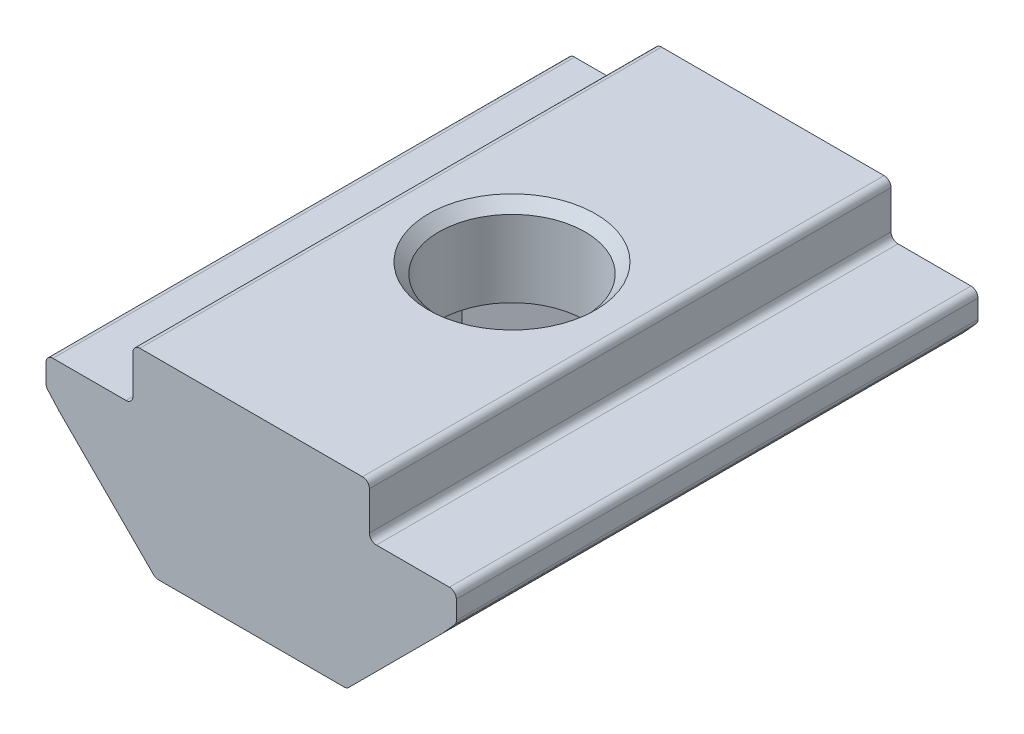
ISO-10303-21;
HEADER;
FILE_DESCRIPTION(('STEP AP214'),'2;1');
FILE_NAME('part.step','',(''),(''),'','','');
FILE_SCHEMA(('AUTOMOTIVE_DESIGN { 1 0 10303 214 1 1 1 1 }'));
ENDSEC;
DATA;
#1=APPLICATION_CONTEXT('core data for automotive mechanical design processes');
#2=APPLICATION_PROTOCOL_DEFINITION('international standard','automotive_design',2000,#1);
#3=PRODUCT_CONTEXT('',#1,'mechanical');
#4=PRODUCT('Part','Part','',(#3));
#5=PRODUCT_RELATED_PRODUCT_CATEGORY('part','',(#4));
#6=PRODUCT_DEFINITION_FORMATION('','',#4);
#7=PRODUCT_DEFINITION_CONTEXT('part definition',#1,'design');
#8=PRODUCT_DEFINITION('design','',#6,#7);
#9=PRODUCT_DEFINITION_SHAPE('','',#8);
#10=(LENGTH_UNIT() NAMED_UNIT(*) SI_UNIT(.MILLI.,.METRE.));
#11=(NAMED_UNIT(*) PLANE_ANGLE_UNIT() SI_UNIT($,.RADIAN.));
#12=(NAMED_UNIT(*) SI_UNIT($,.STERADIAN.) SOLID_ANGLE_UNIT());
#13=UNCERTAINTY_MEASURE_WITH_UNIT(LENGTH_MEASURE(1.E-05),#10,'distance_accuracy_value','');
#14=(GEOMETRIC_REPRESENTATION_CONTEXT(3) GLOBAL_UNCERTAINTY_ASSIGNED_CONTEXT((#13)) GLOBAL_UNIT_ASSIGNED_CONTEXT((#10,
#11,#12)) REPRESENTATION_CONTEXT('',''));
#15=CARTESIAN_POINT('',(0.,0.,0.));
#16=DIRECTION('',(0.,0.,1.));
#17=DIRECTION('',(1.,0.,0.));
#18=AXIS2_PLACEMENT_3D('',#15,#16,#17);
#19=CARTESIAN_POINT('',(8.25,0.,15.));
#20=DIRECTION('',(0.,-1.,0.));
#21=DIRECTION('',(1.,0.,0.));
#22=AXIS2_PLACEMENT_3D('',#19,#20,#21);
#23=PLANE('',#22);
#24=DIRECTION('',(-0.866025403784438,0.,-0.5));
#25=VECTOR('',#24,1.);
#26=CARTESIAN_POINT('',(5.5,0.,11.4259818304895));
#27=LINE('',#26,#25);
#28=CARTESIAN_POINT('',(5.5,0.,11.4259818304895));
#29=VERTEX_POINT('',#28);
#30=CARTESIAN_POINT('',(2.83284271247463,0.,9.88609785256561));
#31=VERTEX_POINT('',#30);
#32=EDGE_CURVE('E267',#29,#31,#27,.T.);
#33=ORIENTED_EDGE('',*,*,#32,.F.);
#34=DIRECTION('',(-0.866025403784439,0.,0.5));
#35=VECTOR('',#34,1.);
#36=CARTESIAN_POINT('',(8.90000000000001,0.,9.46299091524473));
#37=LINE('',#36,#35);
#38=CARTESIAN_POINT('',(8.16715728752537,0.,9.88609785256561));
#39=VERTEX_POINT('',#38);
#40=EDGE_CURVE('E269',#39,#29,#37,.T.);
#41=ORIENTED_EDGE('',*,*,#40,.F.);
#42=DIRECTION('',(0.,0.,-1.));
#43=VECTOR('',#42,1.);
#44=CARTESIAN_POINT('',(8.16715728752537,0.,15.));
#45=LINE('',#44,#43);
#46=CARTESIAN_POINT('',(8.16715728752537,0.,15.));
#47=VERTEX_POINT('',#46);
#48=EDGE_CURVE('E450',#39,#47,#45,.F.);
#49=ORIENTED_EDGE('',*,*,#48,.T.);
#50=DIRECTION('',(-1.,0.,0.));
#51=VECTOR('',#50,1.);
#52=CARTESIAN_POINT('',(8.25,0.,15.));
#53=LINE('',#52,#51);
#54=CARTESIAN_POINT('',(2.83284271247463,0.,15.));
#55=VERTEX_POINT('',#54);
#56=EDGE_CURVE('E363',#47,#55,#53,.T.);
#57=ORIENTED_EDGE('',*,*,#56,.T.);
#58=DIRECTION('',(0.,0.,-1.));
#59=VECTOR('',#58,1.);
#60=CARTESIAN_POINT('',(2.83284271247463,0.,15.));
#61=LINE('',#60,#59);
#62=EDGE_CURVE('E455',#55,#31,#61,.T.);
#63=ORIENTED_EDGE('',*,*,#62,.T.);
#64=EDGE_LOOP('',(#33,#41,#49,#57,#63));
#65=FACE_BOUND('',#64,.T.);
#66=ADVANCED_FACE('F33',(#65),#23,.T.);
#67=CARTESIAN_POINT('',(5.5,5.49999999999999,7.5));
#68=DIRECTION('',(0.,-1.,0.));
#69=DIRECTION('',(1.,0.,0.));
#70=AXIS2_PLACEMENT_3D('',#67,#68,#69);
#71=CYLINDRICAL_SURFACE('',#70,2.1);
#72=CARTESIAN_POINT('',(5.5,5.19999999999999,7.5));
#73=DIRECTION('',(0.,-1.,0.));
#74=DIRECTION('',(1.,0.,0.));
#75=AXIS2_PLACEMENT_3D('',#72,#73,#74);
#76=CIRCLE('',#75,2.1);
#77=CARTESIAN_POINT('',(7.6,5.19999999999999,7.5));
#78=VERTEX_POINT('',#77);
#79=EDGE_CURVE('E303',#78,#78,#76,.T.);
#80=ORIENTED_EDGE('',*,*,#79,.F.);
#81=EDGE_LOOP('',(#80));
#82=FACE_BOUND('',#81,.T.);
#83=CARTESIAN_POINT('',(5.5,3.,7.5));
#84=DIRECTION('',(0.,-1.,0.));
#85=DIRECTION('',(1.,0.,0.));
#86=AXIS2_PLACEMENT_3D('',#83,#84,#85);
#87=CIRCLE('',#86,2.1);
#88=CARTESIAN_POINT('',(7.6,3.,7.5));
#89=VERTEX_POINT('',#88);
#90=EDGE_CURVE('E302',#89,#89,#87,.F.);
#91=ORIENTED_EDGE('',*,*,#90,.F.);
#92=EDGE_LOOP('',(#91));
#93=FACE_BOUND('',#92,.T.);
#94=ADVANCED_FACE('F625',(#82,#93),#71,.F.);
#95=CARTESIAN_POINT('',(2.83284271247463,0.200000000000017,15.));
#96=DIRECTION('',(0.,0.,-1.));
#97=DIRECTION('',(-1.,0.,0.));
#98=AXIS2_PLACEMENT_3D('',#95,#96,#97);
#99=CYLINDRICAL_SURFACE('',#98,0.200000000000011);
#100=CARTESIAN_POINT('',(2.83284271247463,0.200000000000017,5.11390214743439));
#101=DIRECTION('',(-0.5,0.,-0.866025403784439));
#102=DIRECTION('',(0.866025403784439,0.,-0.5));
#103=AXIS2_PLACEMENT_3D('',#100,#101,#102);
#104=ELLIPSE('',#103,0.230940107675863,0.200000000000011);
#105=CARTESIAN_POINT('',(2.69142135623731,0.0585786437626995,5.19555180552717));
#106=VERTEX_POINT('',#105);
#107=CARTESIAN_POINT('',(2.83284271247463,0.,5.11390214743439));
#108=VERTEX_POINT('',#107);
#109=EDGE_CURVE('E484',#106,#108,#104,.F.);
#110=ORIENTED_EDGE('',*,*,#109,.F.);
#111=DIRECTION('',(0.,0.,-1.));
#112=VECTOR('',#111,1.);
#113=CARTESIAN_POINT('',(2.69142135623731,0.0585786437626995,15.));
#114=LINE('',#113,#112);
#115=CARTESIAN_POINT('',(2.69142135623731,0.0585786437626996,0.));
#116=VERTEX_POINT('',#115);
#117=EDGE_CURVE('E459',#116,#106,#114,.F.);
#118=ORIENTED_EDGE('',*,*,#117,.F.);
#119=CARTESIAN_POINT('',(2.83284271247463,0.200000000000017,0.));
#120=DIRECTION('',(0.,0.,-1.));
#121=DIRECTION('',(-1.,0.,0.));
#122=AXIS2_PLACEMENT_3D('',#119,#120,#121);
#123=CIRCLE('',#122,0.200000000000011);
#124=CARTESIAN_POINT('',(2.83284271247463,0.,0.));
#125=VERTEX_POINT('',#124);
#126=EDGE_CURVE('E392',#125,#116,#123,.T.);
#127=ORIENTED_EDGE('',*,*,#126,.F.);
#128=EDGE_CURVE('E454',#108,#125,#61,.T.);
#129=ORIENTED_EDGE('',*,*,#128,.F.);
#130=EDGE_LOOP('',(#110,#118,#127,#129));
#131=FACE_BOUND('',#130,.T.);
#132=ADVANCED_FACE('F538',(#131),#99,.T.);
#133=CARTESIAN_POINT('',(8.16715728752537,0.200000000000016,15.));
#134=DIRECTION('',(0.,0.,-1.));
#135=DIRECTION('',(-1.,0.,0.));
#136=AXIS2_PLACEMENT_3D('',#133,#134,#135);
#137=CYLINDRICAL_SURFACE('',#136,0.200000000000011);
#138=CARTESIAN_POINT('',(8.16715728752537,0.200000000000016,9.88609785256561));
#139=DIRECTION('',(0.5,0.,0.866025403784439));
#140=DIRECTION('',(0.866025403784439,0.,-0.5));
#141=AXIS2_PLACEMENT_3D('',#138,#139,#140);
#142=ELLIPSE('',#141,0.230940107675863,0.200000000000011);
#143=CARTESIAN_POINT('',(8.30857864376269,0.0585786437626995,9.80444819447283));
#144=VERTEX_POINT('',#143);
#145=EDGE_CURVE('E480',#144,#39,#142,.F.);
#146=ORIENTED_EDGE('',*,*,#145,.F.);
#147=DIRECTION('',(0.,0.,-1.));
#148=VECTOR('',#147,1.);
#149=CARTESIAN_POINT('',(8.30857864376269,0.0585786437626995,15.));
#150=LINE('',#149,#148);
#151=CARTESIAN_POINT('',(8.30857864376269,0.0585786437626999,15.));
#152=VERTEX_POINT('',#151);
#153=EDGE_CURVE('E468',#152,#144,#150,.T.);
#154=ORIENTED_EDGE('',*,*,#153,.F.);
#155=CARTESIAN_POINT('',(8.16715728752537,0.200000000000016,15.));
#156=DIRECTION('',(0.,0.,-1.));
#157=DIRECTION('',(-1.,0.,0.));
#158=AXIS2_PLACEMENT_3D('',#155,#156,#157);
#159=CIRCLE('',#158,0.200000000000011);
#160=EDGE_CURVE('E406',#47,#152,#159,.F.);
#161=ORIENTED_EDGE('',*,*,#160,.F.);
#162=ORIENTED_EDGE('',*,*,#48,.F.);
#163=EDGE_LOOP('',(#146,#154,#161,#162));
#164=FACE_BOUND('',#163,.T.);
#165=ADVANCED_FACE('F503',(#164),#137,.T.);
#166=CARTESIAN_POINT('',(2.75,0.,15.));
#167=DIRECTION('',(-0.707106781186547,-0.707106781186549,0.));
#168=DIRECTION('',(0.707106781186549,-0.707106781186547,0.));
#169=AXIS2_PLACEMENT_3D('',#166,#167,#168);
#170=PLANE('',#169);
#171=DIRECTION('',(0.654653670707978,-0.654653670707976,-0.377964473009228));
#172=VECTOR('',#171,1.);
#173=CARTESIAN_POINT('',(0.315659849033342,2.43434015096666,6.56719835124173));
#174=LINE('',#173,#172);
#175=CARTESIAN_POINT('',(2.1,0.650000000000002,5.53700908475527));
#176=VERTEX_POINT('',#175);
#177=EDGE_CURVE('E300',#176,#106,#174,.T.);
#178=ORIENTED_EDGE('',*,*,#177,.F.);
#179=DIRECTION('',(0.,0.,-1.));
#180=VECTOR('',#179,1.);
#181=CARTESIAN_POINT('',(2.1,0.650000000000003,15.));
#182=LINE('',#181,#180);
#183=CARTESIAN_POINT('',(2.1,0.650000000000002,9.46299091524472));
#184=VERTEX_POINT('',#183);
#185=EDGE_CURVE('E11',#184,#176,#182,.T.);
#186=ORIENTED_EDGE('',*,*,#185,.F.);
#187=DIRECTION('',(-0.654653670707978,0.654653670707976,-0.377964473009228));
#188=VECTOR('',#187,1.);
#189=CARTESIAN_POINT('',(4.0271972938238,-1.27719729382379,10.5756587916154));
#190=LINE('',#189,#188);
#191=CARTESIAN_POINT('',(2.69142135623731,0.0585786437626995,9.80444819447283));
#192=VERTEX_POINT('',#191);
#193=EDGE_CURVE('E298',#192,#184,#190,.T.);
#194=ORIENTED_EDGE('',*,*,#193,.F.);
#195=CARTESIAN_POINT('',(2.69142135623731,0.0585786437626996,15.));
#196=VERTEX_POINT('',#195);
#197=EDGE_CURVE('E458',#192,#196,#114,.F.);
#198=ORIENTED_EDGE('',*,*,#197,.T.);
#199=DIRECTION('',(-0.707106781186548,0.707106781186547,0.));
#200=VECTOR('',#199,1.);
#201=CARTESIAN_POINT('',(2.75,0.,15.));
#202=LINE('',#201,#200);
#203=CARTESIAN_POINT('',(0.,2.75,15.));
#204=VERTEX_POINT('',#203);
#205=EDGE_CURVE('E366',#196,#204,#202,.T.);
#206=ORIENTED_EDGE('',*,*,#205,.T.);
#207=DIRECTION('',(0.,0.,-1.));
#208=VECTOR('',#207,1.);
#209=CARTESIAN_POINT('',(0.,2.75,15.));
#210=LINE('',#209,#208);
#211=CARTESIAN_POINT('',(0.,2.75,0.));
#212=VERTEX_POINT('',#211);
#213=EDGE_CURVE('E378',#204,#212,#210,.T.);
#214=ORIENTED_EDGE('',*,*,#213,.T.);
#215=DIRECTION('',(-0.707106781186548,0.707106781186547,0.));
#216=VECTOR('',#215,1.);
#217=CARTESIAN_POINT('',(2.75,0.,0.));
#218=LINE('',#217,#216);
#219=EDGE_CURVE('E360',#116,#212,#218,.T.);
#220=ORIENTED_EDGE('',*,*,#219,.F.);
#221=ORIENTED_EDGE('',*,*,#117,.T.);
#222=EDGE_LOOP('',(#178,#186,#194,#198,#206,#214,#220,#221));
#223=FACE_BOUND('',#222,.T.);
#224=ADVANCED_FACE('F522',(#223),#170,.T.);
#225=DIRECTION('',(0.866025403784439,0.,-0.5));
#226=VECTOR('',#225,1.);
#227=CARTESIAN_POINT('',(2.1,0.,5.53700908475527));
#228=LINE('',#227,#226);
#229=CARTESIAN_POINT('',(5.50000000000001,0.,3.57401816951054));
#230=VERTEX_POINT('',#229);
#231=EDGE_CURVE('E250',#108,#230,#228,.T.);
#232=ORIENTED_EDGE('',*,*,#231,.F.);
#233=ORIENTED_EDGE('',*,*,#128,.T.);
#234=DIRECTION('',(-1.,0.,0.));
#235=VECTOR('',#234,1.);
#236=CARTESIAN_POINT('',(8.25,0.,0.));
#237=LINE('',#236,#235);
#238=CARTESIAN_POINT('',(8.16715728752537,0.,0.));
#239=VERTEX_POINT('',#238);
#240=EDGE_CURVE('E374',#239,#125,#237,.T.);
#241=ORIENTED_EDGE('',*,*,#240,.F.);
#242=CARTESIAN_POINT('',(8.16715728752537,0.,5.11390214743439));
#243=VERTEX_POINT('',#242);
#244=EDGE_CURVE('E451',#239,#243,#45,.F.);
#245=ORIENTED_EDGE('',*,*,#244,.T.);
#246=DIRECTION('',(0.866025403784438,0.,0.500000000000001));
#247=VECTOR('',#246,1.);
#248=CARTESIAN_POINT('',(5.50000000000001,0.,3.57401816951054));
#249=LINE('',#248,#247);
#250=EDGE_CURVE('E48',#230,#243,#249,.T.);
#251=ORIENTED_EDGE('',*,*,#250,.F.);
#252=EDGE_LOOP('',(#232,#233,#241,#245,#251));
#253=FACE_BOUND('',#252,.T.);
#254=ADVANCED_FACE('F541',(#253),#23,.T.);
#255=CARTESIAN_POINT('',(11.,2.75000000000001,15.));
#256=DIRECTION('',(0.707106781186548,-0.707106781186547,0.));
#257=DIRECTION('',(0.707106781186547,0.707106781186548,0.));
#258=AXIS2_PLACEMENT_3D('',#255,#256,#257);
#259=PLANE('',#258);
#260=DIRECTION('',(-0.654653670707976,-0.654653670707978,0.377964473009227));
#261=VECTOR('',#260,1.);
#262=CARTESIAN_POINT('',(9.32994556331906,1.07994556331907,9.21476172852558));
#263=LINE('',#262,#261);
#264=CARTESIAN_POINT('',(8.90000000000001,0.650000000000015,9.46299091524473));
#265=VERTEX_POINT('',#264);
#266=EDGE_CURVE('E296',#265,#144,#263,.T.);
#267=ORIENTED_EDGE('',*,*,#266,.F.);
#268=DIRECTION('',(0.,0.,1.));
#269=VECTOR('',#268,1.);
#270=CARTESIAN_POINT('',(8.90000000000001,0.650000000000015,15.));
#271=LINE('',#270,#269);
#272=CARTESIAN_POINT('',(8.90000000000001,0.650000000000015,5.53700908475527));
#273=VERTEX_POINT('',#272);
#274=EDGE_CURVE('E41',#273,#265,#271,.T.);
#275=ORIENTED_EDGE('',*,*,#274,.F.);
#276=DIRECTION('',(0.654653670707976,0.654653670707978,0.377964473009227));
#277=VECTOR('',#276,1.);
#278=CARTESIAN_POINT('',(13.0414830081095,4.79148300810953,7.92809541433156));
#279=LINE('',#278,#277);
#280=CARTESIAN_POINT('',(8.30857864376269,0.0585786437626995,5.19555180552717));
#281=VERTEX_POINT('',#280);
#282=EDGE_CURVE('E284',#281,#273,#279,.T.);
#283=ORIENTED_EDGE('',*,*,#282,.F.);
#284=CARTESIAN_POINT('',(8.30857864376269,0.0585786437626999,0.));
#285=VERTEX_POINT('',#284);
#286=EDGE_CURVE('E467',#281,#285,#150,.T.);
#287=ORIENTED_EDGE('',*,*,#286,.T.);
#288=DIRECTION('',(-0.707106781186547,-0.707106781186548,0.));
#289=VECTOR('',#288,1.);
#290=CARTESIAN_POINT('',(11.,2.75000000000001,0.));
#291=LINE('',#290,#289);
#292=CARTESIAN_POINT('',(11.,2.75000000000001,0.));
#293=VERTEX_POINT('',#292);
#294=EDGE_CURVE('E371',#293,#285,#291,.T.);
#295=ORIENTED_EDGE('',*,*,#294,.F.);
#296=DIRECTION('',(0.,0.,-1.));
#297=VECTOR('',#296,1.);
#298=CARTESIAN_POINT('',(11.,2.75000000000001,15.));
#299=LINE('',#298,#297);
#300=CARTESIAN_POINT('',(11.,2.75,15.));
#301=VERTEX_POINT('',#300);
#302=EDGE_CURVE('E368',#301,#293,#299,.T.);
#303=ORIENTED_EDGE('',*,*,#302,.F.);
#304=DIRECTION('',(-0.707106781186547,-0.707106781186548,0.));
#305=VECTOR('',#304,1.);
#306=CARTESIAN_POINT('',(11.,2.75000000000001,15.));
#307=LINE('',#306,#305);
#308=EDGE_CURVE('E359',#301,#152,#307,.T.);
#309=ORIENTED_EDGE('',*,*,#308,.T.);
#310=ORIENTED_EDGE('',*,*,#153,.T.);
#311=EDGE_LOOP('',(#267,#275,#283,#287,#295,#303,#309,#310));
#312=FACE_BOUND('',#311,.T.);
#313=ADVANCED_FACE('F497',(#312),#259,.T.);
#314=CARTESIAN_POINT('',(0.,5.49999999999999,15.));
#315=DIRECTION('',(0.,1.,0.));
#316=DIRECTION('',(-1.,0.,0.));
#317=AXIS2_PLACEMENT_3D('',#314,#315,#316);
#318=PLANE('',#317);
#319=CARTESIAN_POINT('',(5.5,5.49999999999999,7.5));
#320=DIRECTION('',(0.,-1.,0.));
#321=DIRECTION('',(1.,0.,0.));
#322=AXIS2_PLACEMENT_3D('',#319,#320,#321);
#323=CIRCLE('',#322,2.4);
#324=CARTESIAN_POINT('',(7.9,5.49999999999999,7.5));
#325=VERTEX_POINT('',#324);
#326=EDGE_CURVE('E306',#325,#325,#323,.T.);
#327=ORIENTED_EDGE('',*,*,#326,.T.);
#328=EDGE_LOOP('',(#327));
#329=FACE_BOUND('',#328,.T.);
#330=DIRECTION('',(1.,0.,0.));
#331=VECTOR('',#330,1.);
#332=CARTESIAN_POINT('',(0.,5.49999999999999,15.));
#333=LINE('',#332,#331);
#334=CARTESIAN_POINT('',(2.30000000000001,5.49999999999999,15.));
#335=VERTEX_POINT('',#334);
#336=CARTESIAN_POINT('',(8.69999999999999,5.49999999999999,15.));
#337=VERTEX_POINT('',#336);
#338=EDGE_CURVE('E356',#335,#337,#333,.T.);
#339=ORIENTED_EDGE('',*,*,#338,.T.);
#340=DIRECTION('',(0.,0.,1.));
#341=VECTOR('',#340,1.);
#342=CARTESIAN_POINT('',(8.69999999999999,5.49999999999999,0.));
#343=LINE('',#342,#341);
#344=CARTESIAN_POINT('',(8.69999999999999,5.49999999999999,0.));
#345=VERTEX_POINT('',#344);
#346=EDGE_CURVE('E448',#337,#345,#343,.F.);
#347=ORIENTED_EDGE('',*,*,#346,.T.);
#348=DIRECTION('',(1.,0.,0.));
#349=VECTOR('',#348,1.);
#350=CARTESIAN_POINT('',(0.,5.49999999999999,0.));
#351=LINE('',#350,#349);
#352=CARTESIAN_POINT('',(2.30000000000001,5.49999999999999,0.));
#353=VERTEX_POINT('',#352);
#354=EDGE_CURVE('E352',#353,#345,#351,.T.);
#355=ORIENTED_EDGE('',*,*,#354,.F.);
#356=DIRECTION('',(0.,0.,1.));
#357=VECTOR('',#356,1.);
#358=CARTESIAN_POINT('',(2.30000000000001,5.49999999999999,15.));
#359=LINE('',#358,#357);
#360=EDGE_CURVE('E445',#353,#335,#359,.T.);
#361=ORIENTED_EDGE('',*,*,#360,.T.);
#362=EDGE_LOOP('',(#339,#347,#355,#361));
#363=FACE_BOUND('',#362,.T.);
#364=ADVANCED_FACE('F586',(#329,#363),#318,.T.);
#365=CARTESIAN_POINT('',(0.,0.,15.));
#366=DIRECTION('',(0.,0.,-1.));
#367=DIRECTION('',(-1.,0.,0.));
#368=AXIS2_PLACEMENT_3D('',#365,#366,#367);
#369=PLANE('',#368);
#370=DIRECTION('',(0.670288205805707,0.742100883409908,0.));
#371=VECTOR('',#370,1.);
#372=CARTESIAN_POINT('',(11.,2.75,15.));
#373=LINE('',#372,#371);
#374=CARTESIAN_POINT('',(11.348420176682,3.13574887440058,15.));
#375=VERTEX_POINT('',#374);
#376=EDGE_CURVE('E313',#301,#375,#373,.T.);
#377=ORIENTED_EDGE('',*,*,#376,.T.);
#378=CARTESIAN_POINT('',(11.2,3.26980651556173,15.));
#379=DIRECTION('',(0.,0.,-1.));
#380=DIRECTION('',(-1.,0.,0.));
#381=AXIS2_PLACEMENT_3D('',#378,#379,#380);
#382=CIRCLE('',#381,0.200000000000011);
#383=CARTESIAN_POINT('',(11.4,3.26980651556173,15.));
#384=VERTEX_POINT('',#383);
#385=EDGE_CURVE('E420',#375,#384,#382,.F.);
#386=ORIENTED_EDGE('',*,*,#385,.T.);
#387=DIRECTION('',(0.,1.,0.));
#388=VECTOR('',#387,1.);
#389=CARTESIAN_POINT('',(11.4,3.19285480602654,15.));
#390=LINE('',#389,#388);
#391=CARTESIAN_POINT('',(11.4,3.79999999999998,15.));
#392=VERTEX_POINT('',#391);
#393=EDGE_CURVE('E310',#384,#392,#390,.T.);
#394=ORIENTED_EDGE('',*,*,#393,.T.);
#395=CARTESIAN_POINT('',(11.2,3.79999999999998,15.));
#396=DIRECTION('',(0.,0.,-1.));
#397=DIRECTION('',(-1.,0.,0.));
#398=AXIS2_PLACEMENT_3D('',#395,#396,#397);
#399=CIRCLE('',#398,0.200000000000011);
#400=CARTESIAN_POINT('',(11.2,3.99999999999999,15.));
#401=VERTEX_POINT('',#400);
#402=EDGE_CURVE('E418',#392,#401,#399,.F.);
#403=ORIENTED_EDGE('',*,*,#402,.T.);
#404=DIRECTION('',(1.,0.,0.));
#405=VECTOR('',#404,1.);
#406=CARTESIAN_POINT('',(8.9,3.99999999999999,15.));
#407=LINE('',#406,#405);
#408=CARTESIAN_POINT('',(9.10000000000001,3.99999999999999,15.));
#409=VERTEX_POINT('',#408);
#410=EDGE_CURVE('E349',#409,#401,#407,.T.);
#411=ORIENTED_EDGE('',*,*,#410,.F.);
#412=CARTESIAN_POINT('',(9.10000000000001,4.2,15.));
#413=DIRECTION('',(0.,0.,-1.));
#414=DIRECTION('',(-1.,0.,0.));
#415=AXIS2_PLACEMENT_3D('',#412,#413,#414);
#416=CIRCLE('',#415,0.200000000000011);
#417=CARTESIAN_POINT('',(8.9,4.2,15.));
#418=VERTEX_POINT('',#417);
#419=EDGE_CURVE('E56',#409,#418,#416,.T.);
#420=ORIENTED_EDGE('',*,*,#419,.T.);
#421=DIRECTION('',(0.,-1.,0.));
#422=VECTOR('',#421,1.);
#423=CARTESIAN_POINT('',(8.9,5.49999999999999,15.));
#424=LINE('',#423,#422);
#425=CARTESIAN_POINT('',(8.9,5.29999999999998,15.));
#426=VERTEX_POINT('',#425);
#427=EDGE_CURVE('E340',#426,#418,#424,.T.);
#428=ORIENTED_EDGE('',*,*,#427,.F.);
#429=CARTESIAN_POINT('',(8.69999999999999,5.29999999999998,15.));
#430=DIRECTION('',(0.,0.,-1.));
#431=DIRECTION('',(-1.,0.,0.));
#432=AXIS2_PLACEMENT_3D('',#429,#430,#431);
#433=CIRCLE('',#432,0.200000000000011);
#434=EDGE_CURVE('E412',#426,#337,#433,.F.);
#435=ORIENTED_EDGE('',*,*,#434,.T.);
#436=ORIENTED_EDGE('',*,*,#338,.F.);
#437=CARTESIAN_POINT('',(2.30000000000001,5.29999999999998,15.));
#438=DIRECTION('',(0.,0.,-1.));
#439=DIRECTION('',(-1.,0.,0.));
#440=AXIS2_PLACEMENT_3D('',#437,#438,#439);
#441=CIRCLE('',#440,0.200000000000011);
#442=CARTESIAN_POINT('',(2.1,5.29999999999998,15.));
#443=VERTEX_POINT('',#442);
#444=EDGE_CURVE('E408',#335,#443,#441,.F.);
#445=ORIENTED_EDGE('',*,*,#444,.T.);
#446=DIRECTION('',(0.,1.,0.));
#447=VECTOR('',#446,1.);
#448=CARTESIAN_POINT('',(2.1,3.99999999999999,15.));
#449=LINE('',#448,#447);
#450=CARTESIAN_POINT('',(2.1,4.2,15.));
#451=VERTEX_POINT('',#450);
#452=EDGE_CURVE('E337',#451,#443,#449,.T.);
#453=ORIENTED_EDGE('',*,*,#452,.F.);
#454=CARTESIAN_POINT('',(1.89999999999999,4.2,15.));
#455=DIRECTION('',(0.,0.,-1.));
#456=DIRECTION('',(-1.,0.,0.));
#457=AXIS2_PLACEMENT_3D('',#454,#455,#456);
#458=CIRCLE('',#457,0.200000000000011);
#459=CARTESIAN_POINT('',(1.89999999999999,3.99999999999999,15.));
#460=VERTEX_POINT('',#459);
#461=EDGE_CURVE('E474',#451,#460,#458,.T.);
#462=ORIENTED_EDGE('',*,*,#461,.T.);
#463=DIRECTION('',(1.,0.,0.));
#464=VECTOR('',#463,1.);
#465=CARTESIAN_POINT('',(0.,3.99999999999999,15.));
#466=LINE('',#465,#464);
#467=CARTESIAN_POINT('',(-0.199999999999989,3.99999999999999,15.));
#468=VERTEX_POINT('',#467);
#469=EDGE_CURVE('E328',#468,#460,#466,.T.);
#470=ORIENTED_EDGE('',*,*,#469,.F.);
#471=CARTESIAN_POINT('',(-0.199999999999989,3.79999999999998,15.));
#472=DIRECTION('',(0.,0.,-1.));
#473=DIRECTION('',(-1.,0.,0.));
#474=AXIS2_PLACEMENT_3D('',#471,#472,#473);
#475=CIRCLE('',#474,0.200000000000011);
#476=CARTESIAN_POINT('',(-0.4,3.79999999999998,15.));
#477=VERTEX_POINT('',#476);
#478=EDGE_CURVE('E414',#468,#477,#475,.F.);
#479=ORIENTED_EDGE('',*,*,#478,.T.);
#480=DIRECTION('',(0.,-1.,0.));
#481=VECTOR('',#480,1.);
#482=CARTESIAN_POINT('',(-0.4,3.19285480602654,15.));
#483=LINE('',#482,#481);
#484=CARTESIAN_POINT('',(-0.4,3.26980651556173,15.));
#485=VERTEX_POINT('',#484);
#486=EDGE_CURVE('E324',#477,#485,#483,.T.);
#487=ORIENTED_EDGE('',*,*,#486,.T.);
#488=CARTESIAN_POINT('',(-0.199999999999989,3.26980651556173,15.));
#489=DIRECTION('',(0.,0.,-1.));
#490=DIRECTION('',(-1.,0.,0.));
#491=AXIS2_PLACEMENT_3D('',#488,#489,#490);
#492=CIRCLE('',#491,0.200000000000011);
#493=CARTESIAN_POINT('',(-0.348420176681979,3.13574887440058,15.));
#494=VERTEX_POINT('',#493);
#495=EDGE_CURVE('E416',#485,#494,#492,.F.);
#496=ORIENTED_EDGE('',*,*,#495,.T.);
#497=DIRECTION('',(0.670288205805707,-0.742100883409909,0.));
#498=VECTOR('',#497,1.);
#499=CARTESIAN_POINT('',(0.,2.75,15.));
#500=LINE('',#499,#498);
#501=EDGE_CURVE('E321',#494,#204,#500,.T.);
#502=ORIENTED_EDGE('',*,*,#501,.T.);
#503=ORIENTED_EDGE('',*,*,#205,.F.);
#504=CARTESIAN_POINT('',(2.83284271247463,0.200000000000017,15.));
#505=DIRECTION('',(0.,0.,-1.));
#506=DIRECTION('',(-1.,0.,0.));
#507=AXIS2_PLACEMENT_3D('',#504,#505,#506);
#508=CIRCLE('',#507,0.200000000000011);
#509=EDGE_CURVE('E410',#196,#55,#508,.F.);
#510=ORIENTED_EDGE('',*,*,#509,.T.);
#511=ORIENTED_EDGE('',*,*,#56,.F.);
#512=ORIENTED_EDGE('',*,*,#160,.T.);
#513=ORIENTED_EDGE('',*,*,#308,.F.);
#514=EDGE_LOOP('',(#377,#386,#394,#403,#411,#420,#428,#435,#436,#445,#453,#462,#470,#479,#487,
#496,#502,#503,#510,#511,#512,#513));
#515=FACE_BOUND('',#514,.T.);
#516=ADVANCED_FACE('F524',(#515),#369,.F.);
#517=CARTESIAN_POINT('',(0.,0.,0.));
#518=DIRECTION('',(0.,0.,-1.));
#519=DIRECTION('',(-1.,0.,0.));
#520=AXIS2_PLACEMENT_3D('',#517,#518,#519);
#521=PLANE('',#520);
#522=DIRECTION('',(0.,-1.,0.));
#523=VECTOR('',#522,1.);
#524=CARTESIAN_POINT('',(11.4,3.19285480602654,0.));
#525=LINE('',#524,#523);
#526=CARTESIAN_POINT('',(11.4,3.79999999999998,0.));
#527=VERTEX_POINT('',#526);
#528=CARTESIAN_POINT('',(11.4,3.26980651556173,0.));
#529=VERTEX_POINT('',#528);
#530=EDGE_CURVE('E309',#527,#529,#525,.T.);
#531=ORIENTED_EDGE('',*,*,#530,.T.);
#532=CARTESIAN_POINT('',(11.2,3.26980651556173,0.));
#533=DIRECTION('',(0.,0.,-1.));
#534=DIRECTION('',(-1.,0.,0.));
#535=AXIS2_PLACEMENT_3D('',#532,#533,#534);
#536=CIRCLE('',#535,0.200000000000011);
#537=CARTESIAN_POINT('',(11.348420176682,3.13574887440058,0.));
#538=VERTEX_POINT('',#537);
#539=EDGE_CURVE('E402',#529,#538,#536,.T.);
#540=ORIENTED_EDGE('',*,*,#539,.T.);
#541=DIRECTION('',(-0.670288205805707,-0.742100883409908,0.));
#542=VECTOR('',#541,1.);
#543=CARTESIAN_POINT('',(11.,2.75,0.));
#544=LINE('',#543,#542);
#545=EDGE_CURVE('E314',#538,#293,#544,.T.);
#546=ORIENTED_EDGE('',*,*,#545,.T.);
#547=ORIENTED_EDGE('',*,*,#294,.T.);
#548=CARTESIAN_POINT('',(8.16715728752537,0.200000000000016,0.));
#549=DIRECTION('',(0.,0.,-1.));
#550=DIRECTION('',(-1.,0.,0.));
#551=AXIS2_PLACEMENT_3D('',#548,#549,#550);
#552=CIRCLE('',#551,0.200000000000011);
#553=EDGE_CURVE('E388',#285,#239,#552,.T.);
#554=ORIENTED_EDGE('',*,*,#553,.T.);
#555=ORIENTED_EDGE('',*,*,#240,.T.);
#556=ORIENTED_EDGE('',*,*,#126,.T.);
#557=ORIENTED_EDGE('',*,*,#219,.T.);
#558=DIRECTION('',(-0.670288205805707,0.742100883409909,0.));
#559=VECTOR('',#558,1.);
#560=CARTESIAN_POINT('',(0.,2.75,0.));
#561=LINE('',#560,#559);
#562=CARTESIAN_POINT('',(-0.348420176681979,3.13574887440058,0.));
#563=VERTEX_POINT('',#562);
#564=EDGE_CURVE('E320',#212,#563,#561,.T.);
#565=ORIENTED_EDGE('',*,*,#564,.T.);
#566=CARTESIAN_POINT('',(-0.199999999999989,3.26980651556173,0.));
#567=DIRECTION('',(0.,0.,-1.));
#568=DIRECTION('',(-1.,0.,0.));
#569=AXIS2_PLACEMENT_3D('',#566,#567,#568);
#570=CIRCLE('',#569,0.200000000000011);
#571=CARTESIAN_POINT('',(-0.4,3.26980651556173,0.));
#572=VERTEX_POINT('',#571);
#573=EDGE_CURVE('E398',#563,#572,#570,.T.);
#574=ORIENTED_EDGE('',*,*,#573,.T.);
#575=DIRECTION('',(0.,1.,0.));
#576=VECTOR('',#575,1.);
#577=CARTESIAN_POINT('',(-0.4,3.19285480602654,0.));
#578=LINE('',#577,#576);
#579=CARTESIAN_POINT('',(-0.4,3.79999999999998,0.));
#580=VERTEX_POINT('',#579);
#581=EDGE_CURVE('E325',#572,#580,#578,.T.);
#582=ORIENTED_EDGE('',*,*,#581,.T.);
#583=CARTESIAN_POINT('',(-0.199999999999989,3.79999999999998,0.));
#584=DIRECTION('',(0.,0.,-1.));
#585=DIRECTION('',(-1.,0.,0.));
#586=AXIS2_PLACEMENT_3D('',#583,#584,#585);
#587=CIRCLE('',#586,0.200000000000011);
#588=CARTESIAN_POINT('',(-0.199999999999989,3.99999999999999,0.));
#589=VERTEX_POINT('',#588);
#590=EDGE_CURVE('E396',#580,#589,#587,.T.);
#591=ORIENTED_EDGE('',*,*,#590,.T.);
#592=DIRECTION('',(1.,0.,0.));
#593=VECTOR('',#592,1.);
#594=CARTESIAN_POINT('',(0.,3.99999999999999,0.));
#595=LINE('',#594,#593);
#596=CARTESIAN_POINT('',(1.89999999999999,3.99999999999999,0.));
#597=VERTEX_POINT('',#596);
#598=EDGE_CURVE('E333',#589,#597,#595,.T.);
#599=ORIENTED_EDGE('',*,*,#598,.T.);
#600=CARTESIAN_POINT('',(1.89999999999999,4.2,0.));
#601=DIRECTION('',(0.,0.,-1.));
#602=DIRECTION('',(-1.,0.,0.));
#603=AXIS2_PLACEMENT_3D('',#600,#601,#602);
#604=CIRCLE('',#603,0.200000000000011);
#605=CARTESIAN_POINT('',(2.1,4.2,0.));
#606=VERTEX_POINT('',#605);
#607=EDGE_CURVE('E476',#597,#606,#604,.F.);
#608=ORIENTED_EDGE('',*,*,#607,.T.);
#609=DIRECTION('',(0.,1.,0.));
#610=VECTOR('',#609,1.);
#611=CARTESIAN_POINT('',(2.1,3.99999999999999,0.));
#612=LINE('',#611,#610);
#613=CARTESIAN_POINT('',(2.1,5.29999999999998,0.));
#614=VERTEX_POINT('',#613);
#615=EDGE_CURVE('E336',#606,#614,#612,.T.);
#616=ORIENTED_EDGE('',*,*,#615,.T.);
#617=CARTESIAN_POINT('',(2.30000000000001,5.29999999999998,0.));
#618=DIRECTION('',(0.,0.,-1.));
#619=DIRECTION('',(-1.,0.,0.));
#620=AXIS2_PLACEMENT_3D('',#617,#618,#619);
#621=CIRCLE('',#620,0.200000000000011);
#622=EDGE_CURVE('E390',#614,#353,#621,.T.);
#623=ORIENTED_EDGE('',*,*,#622,.T.);
#624=ORIENTED_EDGE('',*,*,#354,.T.);
#625=CARTESIAN_POINT('',(8.69999999999999,5.29999999999998,0.));
#626=DIRECTION('',(0.,0.,-1.));
#627=DIRECTION('',(-1.,0.,0.));
#628=AXIS2_PLACEMENT_3D('',#625,#626,#627);
#629=CIRCLE('',#628,0.200000000000011);
#630=CARTESIAN_POINT('',(8.9,5.29999999999998,0.));
#631=VERTEX_POINT('',#630);
#632=EDGE_CURVE('E394',#345,#631,#629,.T.);
#633=ORIENTED_EDGE('',*,*,#632,.T.);
#634=DIRECTION('',(0.,-1.,0.));
#635=VECTOR('',#634,1.);
#636=CARTESIAN_POINT('',(8.9,5.49999999999999,0.));
#637=LINE('',#636,#635);
#638=CARTESIAN_POINT('',(8.9,4.2,0.));
#639=VERTEX_POINT('',#638);
#640=EDGE_CURVE('E345',#631,#639,#637,.T.);
#641=ORIENTED_EDGE('',*,*,#640,.T.);
#642=CARTESIAN_POINT('',(9.10000000000001,4.2,0.));
#643=DIRECTION('',(0.,0.,-1.));
#644=DIRECTION('',(-1.,0.,0.));
#645=AXIS2_PLACEMENT_3D('',#642,#643,#644);
#646=CIRCLE('',#645,0.200000000000011);
#647=CARTESIAN_POINT('',(9.10000000000001,3.99999999999999,0.));
#648=VERTEX_POINT('',#647);
#649=EDGE_CURVE('E472',#639,#648,#646,.F.);
#650=ORIENTED_EDGE('',*,*,#649,.T.);
#651=DIRECTION('',(1.,0.,0.));
#652=VECTOR('',#651,1.);
#653=CARTESIAN_POINT('',(8.9,3.99999999999999,0.));
#654=LINE('',#653,#652);
#655=CARTESIAN_POINT('',(11.2,3.99999999999999,0.));
#656=VERTEX_POINT('',#655);
#657=EDGE_CURVE('E348',#648,#656,#654,.T.);
#658=ORIENTED_EDGE('',*,*,#657,.T.);
#659=CARTESIAN_POINT('',(11.2,3.79999999999998,0.));
#660=DIRECTION('',(0.,0.,-1.));
#661=DIRECTION('',(-1.,0.,0.));
#662=AXIS2_PLACEMENT_3D('',#659,#660,#661);
#663=CIRCLE('',#662,0.200000000000011);
#664=EDGE_CURVE('E400',#656,#527,#663,.T.);
#665=ORIENTED_EDGE('',*,*,#664,.T.);
#666=EDGE_LOOP('',(#531,#540,#546,#547,#554,#555,#556,#557,#565,#574,#582,#591,#599,#608,#616,
#623,#624,#633,#641,#650,#658,#665));
#667=FACE_BOUND('',#666,.T.);
#668=ADVANCED_FACE('F549',(#667),#521,.T.);
#669=CARTESIAN_POINT('',(8.9,5.49999999999999,0.));
#670=DIRECTION('',(-1.,0.,0.));
#671=DIRECTION('',(0.,0.,1.));
#672=AXIS2_PLACEMENT_3D('',#669,#670,#671);
#673=PLANE('',#672);
#674=ORIENTED_EDGE('',*,*,#640,.F.);
#675=DIRECTION('',(0.,0.,1.));
#676=VECTOR('',#675,1.);
#677=CARTESIAN_POINT('',(8.9,5.29999999999998,15.));
#678=LINE('',#677,#676);
#679=EDGE_CURVE('E442',#631,#426,#678,.T.);
#680=ORIENTED_EDGE('',*,*,#679,.T.);
#681=ORIENTED_EDGE('',*,*,#427,.T.);
#682=DIRECTION('',(0.,0.,1.));
#683=VECTOR('',#682,1.);
#684=CARTESIAN_POINT('',(8.9,4.2,0.));
#685=LINE('',#684,#683);
#686=EDGE_CURVE('E440',#418,#639,#685,.F.);
#687=ORIENTED_EDGE('',*,*,#686,.T.);
#688=EDGE_LOOP('',(#674,#680,#681,#687));
#689=FACE_BOUND('',#688,.T.);
#690=ADVANCED_FACE('F577',(#689),#673,.F.);
#691=CARTESIAN_POINT('',(8.9,3.99999999999999,0.));
#692=DIRECTION('',(0.,-1.,0.));
#693=DIRECTION('',(0.,0.,-1.));
#694=AXIS2_PLACEMENT_3D('',#691,#692,#693);
#695=PLANE('',#694);
#696=ORIENTED_EDGE('',*,*,#410,.T.);
#697=DIRECTION('',(0.,0.,-1.));
#698=VECTOR('',#697,1.);
#699=CARTESIAN_POINT('',(11.2,3.99999999999999,0.));
#700=LINE('',#699,#698);
#701=EDGE_CURVE('E425',#401,#656,#700,.T.);
#702=ORIENTED_EDGE('',*,*,#701,.T.);
#703=ORIENTED_EDGE('',*,*,#657,.F.);
#704=DIRECTION('',(0.,0.,1.));
#705=VECTOR('',#704,1.);
#706=CARTESIAN_POINT('',(9.10000000000001,3.99999999999999,15.));
#707=LINE('',#706,#705);
#708=EDGE_CURVE('E422',#648,#409,#707,.T.);
#709=ORIENTED_EDGE('',*,*,#708,.T.);
#710=EDGE_LOOP('',(#696,#702,#703,#709));
#711=FACE_BOUND('',#710,.T.);
#712=ADVANCED_FACE('F569',(#711),#695,.F.);
#713=CARTESIAN_POINT('',(2.1,3.99999999999999,0.));
#714=DIRECTION('',(1.,0.,0.));
#715=DIRECTION('',(0.,0.,-1.));
#716=AXIS2_PLACEMENT_3D('',#713,#714,#715);
#717=PLANE('',#716);
#718=ORIENTED_EDGE('',*,*,#452,.T.);
#719=DIRECTION('',(0.,0.,1.));
#720=VECTOR('',#719,1.);
#721=CARTESIAN_POINT('',(2.1,5.29999999999998,0.));
#722=LINE('',#721,#720);
#723=EDGE_CURVE('E465',#443,#614,#722,.F.);
#724=ORIENTED_EDGE('',*,*,#723,.T.);
#725=ORIENTED_EDGE('',*,*,#615,.F.);
#726=DIRECTION('',(0.,0.,1.));
#727=VECTOR('',#726,1.);
#728=CARTESIAN_POINT('',(2.1,4.2,15.));
#729=LINE('',#728,#727);
#730=EDGE_CURVE('E462',#606,#451,#729,.T.);
#731=ORIENTED_EDGE('',*,*,#730,.T.);
#732=EDGE_LOOP('',(#718,#724,#725,#731));
#733=FACE_BOUND('',#732,.T.);
#734=ADVANCED_FACE('F594',(#733),#717,.F.);
#735=CARTESIAN_POINT('',(0.,3.99999999999999,0.));
#736=DIRECTION('',(0.,-1.,0.));
#737=DIRECTION('',(0.,0.,-1.));
#738=AXIS2_PLACEMENT_3D('',#735,#736,#737);
#739=PLANE('',#738);
#740=ORIENTED_EDGE('',*,*,#598,.F.);
#741=DIRECTION('',(0.,0.,-1.));
#742=VECTOR('',#741,1.);
#743=CARTESIAN_POINT('',(-0.199999999999989,3.99999999999999,15.));
#744=LINE('',#743,#742);
#745=EDGE_CURVE('E438',#589,#468,#744,.F.);
#746=ORIENTED_EDGE('',*,*,#745,.T.);
#747=ORIENTED_EDGE('',*,*,#469,.T.);
#748=DIRECTION('',(0.,0.,1.));
#749=VECTOR('',#748,1.);
#750=CARTESIAN_POINT('',(1.89999999999999,3.99999999999999,0.));
#751=LINE('',#750,#749);
#752=EDGE_CURVE('E436',#460,#597,#751,.F.);
#753=ORIENTED_EDGE('',*,*,#752,.T.);
#754=EDGE_LOOP('',(#740,#746,#747,#753));
#755=FACE_BOUND('',#754,.T.);
#756=ADVANCED_FACE('F604',(#755),#739,.F.);
#757=CARTESIAN_POINT('',(-0.4,3.19285480602654,16.3124404748407));
#758=DIRECTION('',(-1.,0.,0.));
#759=DIRECTION('',(0.,0.,1.));
#760=AXIS2_PLACEMENT_3D('',#757,#758,#759);
#761=PLANE('',#760);
#762=ORIENTED_EDGE('',*,*,#581,.F.);
#763=DIRECTION('',(0.,0.,-1.));
#764=VECTOR('',#763,1.);
#765=CARTESIAN_POINT('',(-0.4,3.26980651556173,16.3124404748407));
#766=LINE('',#765,#764);
#767=EDGE_CURVE('E434',#572,#485,#766,.F.);
#768=ORIENTED_EDGE('',*,*,#767,.T.);
#769=ORIENTED_EDGE('',*,*,#486,.F.);
#770=DIRECTION('',(0.,0.,-1.));
#771=VECTOR('',#770,1.);
#772=CARTESIAN_POINT('',(-0.4,3.79999999999998,0.));
#773=LINE('',#772,#771);
#774=EDGE_CURVE('E431',#477,#580,#773,.T.);
#775=ORIENTED_EDGE('',*,*,#774,.T.);
#776=EDGE_LOOP('',(#762,#768,#769,#775));
#777=FACE_BOUND('',#776,.T.);
#778=ADVANCED_FACE('F612',(#777),#761,.T.);
#779=CARTESIAN_POINT('',(0.,2.75,16.3124404748407));
#780=DIRECTION('',(-0.742100883409909,-0.670288205805707,0.));
#781=DIRECTION('',(0.670288205805707,-0.742100883409909,0.));
#782=AXIS2_PLACEMENT_3D('',#779,#780,#781);
#783=PLANE('',#782);
#784=ORIENTED_EDGE('',*,*,#501,.F.);
#785=DIRECTION('',(0.,0.,-1.));
#786=VECTOR('',#785,1.);
#787=CARTESIAN_POINT('',(-0.348420176681979,3.13574887440058,16.3124404748407));
#788=LINE('',#787,#786);
#789=EDGE_CURVE('E428',#494,#563,#788,.T.);
#790=ORIENTED_EDGE('',*,*,#789,.T.);
#791=ORIENTED_EDGE('',*,*,#564,.F.);
#792=ORIENTED_EDGE('',*,*,#213,.F.);
#793=EDGE_LOOP('',(#784,#790,#791,#792));
#794=FACE_BOUND('',#793,.T.);
#795=ADVANCED_FACE('F531',(#794),#783,.T.);
#796=CARTESIAN_POINT('',(11.4,3.19285480602654,16.3124404748407));
#797=DIRECTION('',(1.,0.,0.));
#798=DIRECTION('',(0.,0.,-1.));
#799=AXIS2_PLACEMENT_3D('',#796,#797,#798);
#800=PLANE('',#799);
#801=ORIENTED_EDGE('',*,*,#393,.F.);
#802=DIRECTION('',(0.,0.,-1.));
#803=VECTOR('',#802,1.);
#804=CARTESIAN_POINT('',(11.4,3.26980651556173,16.3124404748407));
#805=LINE('',#804,#803);
#806=EDGE_CURVE('E385',#384,#529,#805,.T.);
#807=ORIENTED_EDGE('',*,*,#806,.T.);
#808=ORIENTED_EDGE('',*,*,#530,.F.);
#809=DIRECTION('',(0.,0.,-1.));
#810=VECTOR('',#809,1.);
#811=CARTESIAN_POINT('',(11.4,3.79999999999998,15.));
#812=LINE('',#811,#810);
#813=EDGE_CURVE('E381',#527,#392,#812,.F.);
#814=ORIENTED_EDGE('',*,*,#813,.T.);
#815=EDGE_LOOP('',(#801,#807,#808,#814));
#816=FACE_BOUND('',#815,.T.);
#817=ADVANCED_FACE('F561',(#816),#800,.T.);
#818=CARTESIAN_POINT('',(11.,2.75,16.3124404748407));
#819=DIRECTION('',(0.742100883409908,-0.670288205805707,0.));
#820=DIRECTION('',(0.670288205805707,0.742100883409908,0.));
#821=AXIS2_PLACEMENT_3D('',#818,#819,#820);
#822=PLANE('',#821);
#823=ORIENTED_EDGE('',*,*,#545,.F.);
#824=DIRECTION('',(0.,0.,-1.));
#825=VECTOR('',#824,1.);
#826=CARTESIAN_POINT('',(11.348420176682,3.13574887440058,16.3124404748407));
#827=LINE('',#826,#825);
#828=EDGE_CURVE('E404',#538,#375,#827,.F.);
#829=ORIENTED_EDGE('',*,*,#828,.T.);
#830=ORIENTED_EDGE('',*,*,#376,.F.);
#831=ORIENTED_EDGE('',*,*,#302,.T.);
#832=EDGE_LOOP('',(#823,#829,#830,#831));
#833=FACE_BOUND('',#832,.T.);
#834=ADVANCED_FACE('F553',(#833),#822,.T.);
#835=CARTESIAN_POINT('',(5.5,5.19999999999999,7.5));
#836=DIRECTION('',(0.,1.,0.));
#837=DIRECTION('',(-1.,0.,0.));
#838=AXIS2_PLACEMENT_3D('',#835,#836,#837);
#839=CONICAL_SURFACE('',#838,2.1,0.785398163397437);
#840=ORIENTED_EDGE('',*,*,#326,.F.);
#841=EDGE_LOOP('',(#840));
#842=FACE_BOUND('',#841,.T.);
#843=ORIENTED_EDGE('',*,*,#79,.T.);
#844=EDGE_LOOP('',(#843));
#845=FACE_BOUND('',#844,.T.);
#846=ADVANCED_FACE('F663',(#842,#845),#839,.F.);
#847=CARTESIAN_POINT('',(11.2,3.26980651556173,16.3124404748407));
#848=DIRECTION('',(0.,0.,-1.));
#849=DIRECTION('',(-1.,0.,0.));
#850=AXIS2_PLACEMENT_3D('',#847,#848,#849);
#851=CYLINDRICAL_SURFACE('',#850,0.200000000000011);
#852=ORIENTED_EDGE('',*,*,#385,.F.);
#853=ORIENTED_EDGE('',*,*,#828,.F.);
#854=ORIENTED_EDGE('',*,*,#539,.F.);
#855=ORIENTED_EDGE('',*,*,#806,.F.);
#856=EDGE_LOOP('',(#852,#853,#854,#855));
#857=FACE_BOUND('',#856,.T.);
#858=ADVANCED_FACE('F558',(#857),#851,.T.);
#859=CARTESIAN_POINT('',(11.2,3.79999999999998,0.));
#860=DIRECTION('',(0.,0.,1.));
#861=DIRECTION('',(1.,0.,0.));
#862=AXIS2_PLACEMENT_3D('',#859,#860,#861);
#863=CYLINDRICAL_SURFACE('',#862,0.200000000000011);
#864=ORIENTED_EDGE('',*,*,#402,.F.);
#865=ORIENTED_EDGE('',*,*,#813,.F.);
#866=ORIENTED_EDGE('',*,*,#664,.F.);
#867=ORIENTED_EDGE('',*,*,#701,.F.);
#868=EDGE_LOOP('',(#864,#865,#866,#867));
#869=FACE_BOUND('',#868,.T.);
#870=ADVANCED_FACE('F567',(#869),#863,.T.);
#871=CARTESIAN_POINT('',(-0.199999999999989,3.26980651556173,16.3124404748407));
#872=DIRECTION('',(0.,0.,-1.));
#873=DIRECTION('',(-1.,0.,0.));
#874=AXIS2_PLACEMENT_3D('',#871,#872,#873);
#875=CYLINDRICAL_SURFACE('',#874,0.200000000000011);
#876=ORIENTED_EDGE('',*,*,#495,.F.);
#877=ORIENTED_EDGE('',*,*,#767,.F.);
#878=ORIENTED_EDGE('',*,*,#573,.F.);
#879=ORIENTED_EDGE('',*,*,#789,.F.);
#880=EDGE_LOOP('',(#876,#877,#878,#879));
#881=FACE_BOUND('',#880,.T.);
#882=ADVANCED_FACE('F615',(#881),#875,.T.);
#883=CARTESIAN_POINT('',(-0.199999999999989,3.79999999999998,16.3124404748407));
#884=DIRECTION('',(0.,0.,1.));
#885=DIRECTION('',(1.,0.,0.));
#886=AXIS2_PLACEMENT_3D('',#883,#884,#885);
#887=CYLINDRICAL_SURFACE('',#886,0.200000000000011);
#888=ORIENTED_EDGE('',*,*,#478,.F.);
#889=ORIENTED_EDGE('',*,*,#745,.F.);
#890=ORIENTED_EDGE('',*,*,#590,.F.);
#891=ORIENTED_EDGE('',*,*,#774,.F.);
#892=EDGE_LOOP('',(#888,#889,#890,#891));
#893=FACE_BOUND('',#892,.T.);
#894=ADVANCED_FACE('F607',(#893),#887,.T.);
#895=CARTESIAN_POINT('',(8.69999999999999,5.29999999999998,0.));
#896=DIRECTION('',(0.,0.,-1.));
#897=DIRECTION('',(-1.,0.,0.));
#898=AXIS2_PLACEMENT_3D('',#895,#896,#897);
#899=CYLINDRICAL_SURFACE('',#898,0.200000000000011);
#900=ORIENTED_EDGE('',*,*,#632,.F.);
#901=ORIENTED_EDGE('',*,*,#346,.F.);
#902=ORIENTED_EDGE('',*,*,#434,.F.);
#903=ORIENTED_EDGE('',*,*,#679,.F.);
#904=EDGE_LOOP('',(#900,#901,#902,#903));
#905=FACE_BOUND('',#904,.T.);
#906=ADVANCED_FACE('F583',(#905),#899,.T.);
#907=CARTESIAN_POINT('',(2.83284271247463,0.200000000000017,9.88609785256561));
#908=DIRECTION('',(-0.5,0.,0.866025403784438));
#909=DIRECTION('',(-0.866025403784438,0.,-0.5));
#910=AXIS2_PLACEMENT_3D('',#907,#908,#909);
#911=ELLIPSE('',#910,0.230940107675863,0.200000000000011);
#912=EDGE_CURVE('E482',#31,#192,#911,.F.);
#913=ORIENTED_EDGE('',*,*,#912,.F.);
#914=ORIENTED_EDGE('',*,*,#62,.F.);
#915=ORIENTED_EDGE('',*,*,#509,.F.);
#916=ORIENTED_EDGE('',*,*,#197,.F.);
#917=EDGE_LOOP('',(#913,#914,#915,#916));
#918=FACE_BOUND('',#917,.T.);
#919=ADVANCED_FACE('F517',(#918),#99,.T.);
#920=CARTESIAN_POINT('',(2.30000000000001,5.29999999999998,15.));
#921=DIRECTION('',(0.,0.,-1.));
#922=DIRECTION('',(-1.,0.,0.));
#923=AXIS2_PLACEMENT_3D('',#920,#921,#922);
#924=CYLINDRICAL_SURFACE('',#923,0.200000000000011);
#925=ORIENTED_EDGE('',*,*,#622,.F.);
#926=ORIENTED_EDGE('',*,*,#723,.F.);
#927=ORIENTED_EDGE('',*,*,#444,.F.);
#928=ORIENTED_EDGE('',*,*,#360,.F.);
#929=EDGE_LOOP('',(#925,#926,#927,#928));
#930=FACE_BOUND('',#929,.T.);
#931=ADVANCED_FACE('F590',(#930),#924,.T.);
#932=CARTESIAN_POINT('',(9.10000000000001,4.2,0.));
#933=DIRECTION('',(0.,0.,-1.));
#934=DIRECTION('',(-1.,0.,0.));
#935=AXIS2_PLACEMENT_3D('',#932,#933,#934);
#936=CYLINDRICAL_SURFACE('',#935,0.200000000000011);
#937=ORIENTED_EDGE('',*,*,#649,.F.);
#938=ORIENTED_EDGE('',*,*,#686,.F.);
#939=ORIENTED_EDGE('',*,*,#419,.F.);
#940=ORIENTED_EDGE('',*,*,#708,.F.);
#941=EDGE_LOOP('',(#937,#938,#939,#940));
#942=FACE_BOUND('',#941,.T.);
#943=ADVANCED_FACE('F573',(#942),#936,.F.);
#944=CARTESIAN_POINT('',(8.16715728752537,0.200000000000016,5.11390214743439));
#945=DIRECTION('',(0.5,0.,-0.866025403784438));
#946=DIRECTION('',(-0.866025403784438,0.,-0.500000000000001));
#947=AXIS2_PLACEMENT_3D('',#944,#945,#946);
#948=ELLIPSE('',#947,0.230940107675863,0.200000000000011);
#949=EDGE_CURVE('E478',#243,#281,#948,.F.);
#950=ORIENTED_EDGE('',*,*,#949,.F.);
#951=ORIENTED_EDGE('',*,*,#244,.F.);
#952=ORIENTED_EDGE('',*,*,#553,.F.);
#953=ORIENTED_EDGE('',*,*,#286,.F.);
#954=EDGE_LOOP('',(#950,#951,#952,#953));
#955=FACE_BOUND('',#954,.T.);
#956=ADVANCED_FACE('F546',(#955),#137,.T.);
#957=CARTESIAN_POINT('',(1.89999999999999,4.2,0.));
#958=DIRECTION('',(0.,0.,-1.));
#959=DIRECTION('',(-1.,0.,0.));
#960=AXIS2_PLACEMENT_3D('',#957,#958,#959);
#961=CYLINDRICAL_SURFACE('',#960,0.200000000000011);
#962=ORIENTED_EDGE('',*,*,#607,.F.);
#963=ORIENTED_EDGE('',*,*,#752,.F.);
#964=ORIENTED_EDGE('',*,*,#461,.F.);
#965=ORIENTED_EDGE('',*,*,#730,.F.);
#966=EDGE_LOOP('',(#962,#963,#964,#965));
#967=FACE_BOUND('',#966,.T.);
#968=ADVANCED_FACE('F35',(#967),#961,.F.);
#969=CARTESIAN_POINT('',(0.,3.,0.));
#970=DIRECTION('',(0.,-1.,0.));
#971=DIRECTION('',(1.,0.,0.));
#972=AXIS2_PLACEMENT_3D('',#969,#970,#971);
#973=PLANE('',#972);
#974=DIRECTION('',(0.866025403784439,0.,-0.5));
#975=VECTOR('',#974,1.);
#976=CARTESIAN_POINT('',(2.1,3.,5.53700908475527));
#977=LINE('',#976,#975);
#978=CARTESIAN_POINT('',(2.1,3.,5.53700908475527));
#979=VERTEX_POINT('',#978);
#980=CARTESIAN_POINT('',(5.50000000000001,3.,3.57401816951054));
#981=VERTEX_POINT('',#980);
#982=EDGE_CURVE('E247',#979,#981,#977,.T.);
#983=ORIENTED_EDGE('',*,*,#982,.T.);
#984=DIRECTION('',(0.866025403784438,0.,0.500000000000001));
#985=VECTOR('',#984,1.);
#986=CARTESIAN_POINT('',(5.50000000000001,3.,3.57401816951054));
#987=LINE('',#986,#985);
#988=CARTESIAN_POINT('',(8.90000000000001,3.,5.53700908475527));
#989=VERTEX_POINT('',#988);
#990=EDGE_CURVE('E255',#981,#989,#987,.T.);
#991=ORIENTED_EDGE('',*,*,#990,.T.);
#992=DIRECTION('',(0.,0.,1.));
#993=VECTOR('',#992,1.);
#994=CARTESIAN_POINT('',(8.90000000000001,3.,5.53700908475527));
#995=LINE('',#994,#993);
#996=CARTESIAN_POINT('',(8.90000000000001,3.,9.46299091524473));
#997=VERTEX_POINT('',#996);
#998=EDGE_CURVE('E261',#989,#997,#995,.T.);
#999=ORIENTED_EDGE('',*,*,#998,.T.);
#1000=DIRECTION('',(-0.866025403784439,0.,0.5));
#1001=VECTOR('',#1000,1.);
#1002=CARTESIAN_POINT('',(8.90000000000001,3.,9.46299091524473));
#1003=LINE('',#1002,#1001);
#1004=CARTESIAN_POINT('',(5.5,3.,11.4259818304895));
#1005=VERTEX_POINT('',#1004);
#1006=EDGE_CURVE('E273',#997,#1005,#1003,.T.);
#1007=ORIENTED_EDGE('',*,*,#1006,.T.);
#1008=DIRECTION('',(-0.866025403784438,0.,-0.5));
#1009=VECTOR('',#1008,1.);
#1010=CARTESIAN_POINT('',(5.5,3.,11.4259818304895));
#1011=LINE('',#1010,#1009);
#1012=CARTESIAN_POINT('',(2.1,3.,9.46299091524473));
#1013=VERTEX_POINT('',#1012);
#1014=EDGE_CURVE('E276',#1005,#1013,#1011,.T.);
#1015=ORIENTED_EDGE('',*,*,#1014,.T.);
#1016=DIRECTION('',(0.,0.,-1.));
#1017=VECTOR('',#1016,1.);
#1018=CARTESIAN_POINT('',(2.1,3.,9.46299091524473));
#1019=LINE('',#1018,#1017);
#1020=EDGE_CURVE('E252',#1013,#979,#1019,.T.);
#1021=ORIENTED_EDGE('',*,*,#1020,.T.);
#1022=EDGE_LOOP('',(#983,#991,#999,#1007,#1015,#1021));
#1023=FACE_BOUND('',#1022,.T.);
#1024=ORIENTED_EDGE('',*,*,#90,.T.);
#1025=EDGE_LOOP('',(#1024));
#1026=FACE_BOUND('',#1025,.T.);
#1027=ADVANCED_FACE('F263',(#1023,#1026),#973,.T.);
#1028=CARTESIAN_POINT('',(2.1,3.,5.53700908475527));
#1029=DIRECTION('',(-0.5,0.,-0.866025403784439));
#1030=DIRECTION('',(-0.866025403784439,0.,0.5));
#1031=AXIS2_PLACEMENT_3D('',#1028,#1029,#1030);
#1032=PLANE('',#1031);
#1033=ORIENTED_EDGE('',*,*,#177,.T.);
#1034=ORIENTED_EDGE('',*,*,#109,.T.);
#1035=ORIENTED_EDGE('',*,*,#231,.T.);
#1036=DIRECTION('',(0.,-1.,0.));
#1037=VECTOR('',#1036,1.);
#1038=CARTESIAN_POINT('',(5.50000000000001,3.,3.57401816951054));
#1039=LINE('',#1038,#1037);
#1040=EDGE_CURVE('E242',#981,#230,#1039,.T.);
#1041=ORIENTED_EDGE('',*,*,#1040,.F.);
#1042=ORIENTED_EDGE('',*,*,#982,.F.);
#1043=DIRECTION('',(0.,-1.,0.));
#1044=VECTOR('',#1043,1.);
#1045=CARTESIAN_POINT('',(2.1,3.,5.53700908475527));
#1046=LINE('',#1045,#1044);
#1047=EDGE_CURVE('E282',#979,#176,#1046,.T.);
#1048=ORIENTED_EDGE('',*,*,#1047,.T.);
#1049=EDGE_LOOP('',(#1033,#1034,#1035,#1041,#1042,#1048));
#1050=FACE_BOUND('',#1049,.T.);
#1051=ADVANCED_FACE('F244',(#1050),#1032,.F.);
#1052=CARTESIAN_POINT('',(2.1,3.,9.46299091524473));
#1053=DIRECTION('',(-1.,0.,0.));
#1054=DIRECTION('',(0.,0.,1.));
#1055=AXIS2_PLACEMENT_3D('',#1052,#1053,#1054);
#1056=PLANE('',#1055);
#1057=ORIENTED_EDGE('',*,*,#185,.T.);
#1058=ORIENTED_EDGE('',*,*,#1047,.F.);
#1059=ORIENTED_EDGE('',*,*,#1020,.F.);
#1060=DIRECTION('',(0.,-1.,0.));
#1061=VECTOR('',#1060,1.);
#1062=CARTESIAN_POINT('',(2.1,3.,9.46299091524473));
#1063=LINE('',#1062,#1061);
#1064=EDGE_CURVE('E285',#1013,#184,#1063,.T.);
#1065=ORIENTED_EDGE('',*,*,#1064,.T.);
#1066=EDGE_LOOP('',(#1057,#1058,#1059,#1065));
#1067=FACE_BOUND('',#1066,.T.);
#1068=ADVANCED_FACE('F669',(#1067),#1056,.F.);
#1069=CARTESIAN_POINT('',(5.5,3.,11.4259818304895));
#1070=DIRECTION('',(-0.5,0.,0.866025403784438));
#1071=DIRECTION('',(0.866025403784438,0.,0.5));
#1072=AXIS2_PLACEMENT_3D('',#1069,#1070,#1071);
#1073=PLANE('',#1072);
#1074=ORIENTED_EDGE('',*,*,#193,.T.);
#1075=ORIENTED_EDGE('',*,*,#1064,.F.);
#1076=ORIENTED_EDGE('',*,*,#1014,.F.);
#1077=DIRECTION('',(0.,-1.,0.));
#1078=VECTOR('',#1077,1.);
#1079=CARTESIAN_POINT('',(5.5,3.,11.4259818304895));
#1080=LINE('',#1079,#1078);
#1081=EDGE_CURVE('E288',#1005,#29,#1080,.T.);
#1082=ORIENTED_EDGE('',*,*,#1081,.T.);
#1083=ORIENTED_EDGE('',*,*,#32,.T.);
#1084=ORIENTED_EDGE('',*,*,#912,.T.);
#1085=EDGE_LOOP('',(#1074,#1075,#1076,#1082,#1083,#1084));
#1086=FACE_BOUND('',#1085,.T.);
#1087=ADVANCED_FACE('F512',(#1086),#1073,.F.);
#1088=CARTESIAN_POINT('',(8.90000000000001,3.,9.46299091524473));
#1089=DIRECTION('',(0.5,0.,0.866025403784439));
#1090=DIRECTION('',(0.866025403784439,0.,-0.5));
#1091=AXIS2_PLACEMENT_3D('',#1088,#1089,#1090);
#1092=PLANE('',#1091);
#1093=ORIENTED_EDGE('',*,*,#266,.T.);
#1094=ORIENTED_EDGE('',*,*,#145,.T.);
#1095=ORIENTED_EDGE('',*,*,#40,.T.);
#1096=ORIENTED_EDGE('',*,*,#1081,.F.);
#1097=ORIENTED_EDGE('',*,*,#1006,.F.);
#1098=DIRECTION('',(0.,-1.,0.));
#1099=VECTOR('',#1098,1.);
#1100=CARTESIAN_POINT('',(8.90000000000001,3.,9.46299091524473));
#1101=LINE('',#1100,#1099);
#1102=EDGE_CURVE('E291',#997,#265,#1101,.T.);
#1103=ORIENTED_EDGE('',*,*,#1102,.T.);
#1104=EDGE_LOOP('',(#1093,#1094,#1095,#1096,#1097,#1103));
#1105=FACE_BOUND('',#1104,.T.);
#1106=ADVANCED_FACE('F495',(#1105),#1092,.F.);
#1107=CARTESIAN_POINT('',(8.90000000000001,3.,5.53700908475527));
#1108=DIRECTION('',(1.,0.,0.));
#1109=DIRECTION('',(0.,1.,0.));
#1110=AXIS2_PLACEMENT_3D('',#1107,#1108,#1109);
#1111=PLANE('',#1110);
#1112=ORIENTED_EDGE('',*,*,#274,.T.);
#1113=ORIENTED_EDGE('',*,*,#1102,.F.);
#1114=ORIENTED_EDGE('',*,*,#998,.F.);
#1115=DIRECTION('',(0.,-1.,0.));
#1116=VECTOR('',#1115,1.);
#1117=CARTESIAN_POINT('',(8.90000000000001,3.,5.53700908475527));
#1118=LINE('',#1117,#1116);
#1119=EDGE_CURVE('E251',#989,#273,#1118,.T.);
#1120=ORIENTED_EDGE('',*,*,#1119,.T.);
#1121=EDGE_LOOP('',(#1112,#1113,#1114,#1120));
#1122=FACE_BOUND('',#1121,.T.);
#1123=ADVANCED_FACE('F489',(#1122),#1111,.F.);
#1124=CARTESIAN_POINT('',(5.50000000000001,3.,3.57401816951054));
#1125=DIRECTION('',(0.5,0.,-0.866025403784438));
#1126=DIRECTION('',(-0.866025403784438,0.,-0.500000000000001));
#1127=AXIS2_PLACEMENT_3D('',#1124,#1125,#1126);
#1128=PLANE('',#1127);
#1129=ORIENTED_EDGE('',*,*,#282,.T.);
#1130=ORIENTED_EDGE('',*,*,#1119,.F.);
#1131=ORIENTED_EDGE('',*,*,#990,.F.);
#1132=ORIENTED_EDGE('',*,*,#1040,.T.);
#1133=ORIENTED_EDGE('',*,*,#250,.T.);
#1134=ORIENTED_EDGE('',*,*,#949,.T.);
#1135=EDGE_LOOP('',(#1129,#1130,#1131,#1132,#1133,#1134));
#1136=FACE_BOUND('',#1135,.T.);
#1137=ADVANCED_FACE('F256',(#1136),#1128,.F.);
#1138=CLOSED_SHELL('',(#66,#94,#132,#165,#224,#254,#313,#364,#516,#668,#690,#712,#734,#756,#778,
#795,#817,#834,#846,#858,#870,#882,#894,#906,#919,#931,#943,#956,#968,#1027,#1051,#1068,#1087,
#1106,#1123,#1137));
#1139=MANIFOLD_SOLID_BREP('B2',#1138);
#1140=ADVANCED_BREP_SHAPE_REPRESENTATION('',(#18,#1139),#14);
#1141=SHAPE_DEFINITION_REPRESENTATION(#9,#1140);
ENDSEC;
END-ISO-10303-21;
